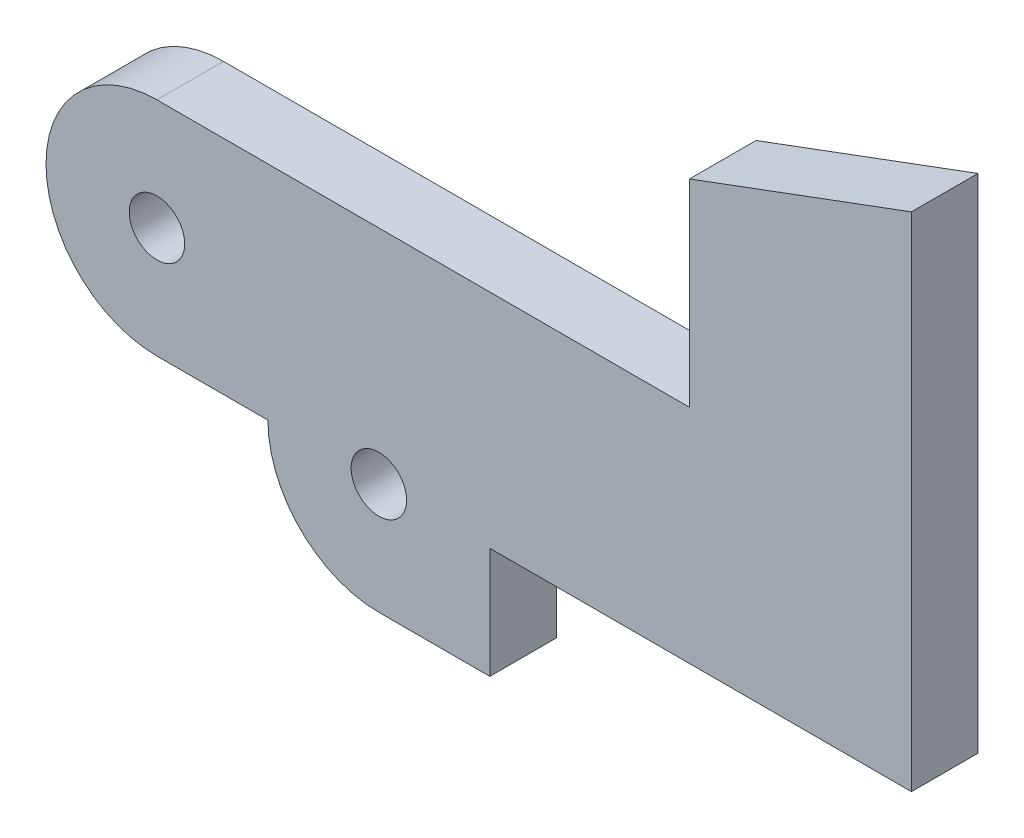
ISO-10303-21;
HEADER;
FILE_DESCRIPTION(('STEP AP214'),'2;1');
FILE_NAME('part.step','',(''),(''),'','','');
FILE_SCHEMA(('AUTOMOTIVE_DESIGN { 1 0 10303 214 1 1 1 1 }'));
ENDSEC;
DATA;
#1=APPLICATION_CONTEXT('core data for automotive mechanical design processes');
#2=APPLICATION_PROTOCOL_DEFINITION('international standard','automotive_design',2000,#1);
#3=PRODUCT_CONTEXT('',#1,'mechanical');
#4=PRODUCT('Part','Part','',(#3));
#5=PRODUCT_RELATED_PRODUCT_CATEGORY('part','',(#4));
#6=PRODUCT_DEFINITION_FORMATION('','',#4);
#7=PRODUCT_DEFINITION_CONTEXT('part definition',#1,'design');
#8=PRODUCT_DEFINITION('design','',#6,#7);
#9=PRODUCT_DEFINITION_SHAPE('','',#8);
#10=(LENGTH_UNIT() NAMED_UNIT(*) SI_UNIT(.MILLI.,.METRE.));
#11=(NAMED_UNIT(*) PLANE_ANGLE_UNIT() SI_UNIT($,.RADIAN.));
#12=(NAMED_UNIT(*) SI_UNIT($,.STERADIAN.) SOLID_ANGLE_UNIT());
#13=UNCERTAINTY_MEASURE_WITH_UNIT(LENGTH_MEASURE(1.E-05),#10,'distance_accuracy_value','');
#14=(GEOMETRIC_REPRESENTATION_CONTEXT(3) GLOBAL_UNCERTAINTY_ASSIGNED_CONTEXT((#13)) GLOBAL_UNIT_ASSIGNED_CONTEXT((#10,
#11,#12)) REPRESENTATION_CONTEXT('',''));
#15=CARTESIAN_POINT('',(0.,0.,0.));
#16=DIRECTION('',(0.,0.,1.));
#17=DIRECTION('',(1.,0.,0.));
#18=AXIS2_PLACEMENT_3D('',#15,#16,#17);
#19=CARTESIAN_POINT('',(-69.6861459032918,39.7463400227915,3.));
#20=DIRECTION('',(0.,1.,0.));
#21=DIRECTION('',(0.,0.,1.));
#22=AXIS2_PLACEMENT_3D('',#19,#20,#21);
#23=PLANE('',#22);
#24=DIRECTION('',(1.,0.,0.));
#25=VECTOR('',#24,1.);
#26=CARTESIAN_POINT('',(-69.6861459032918,39.7463400227915,0.));
#27=LINE('',#26,#25);
#28=CARTESIAN_POINT('',(-69.6861459032918,39.7463400227915,0.));
#29=VERTEX_POINT('',#28);
#30=CARTESIAN_POINT('',(-64.6861459032918,39.7463400227915,0.));
#31=VERTEX_POINT('',#30);
#32=EDGE_CURVE('E151',#29,#31,#27,.T.);
#33=ORIENTED_EDGE('',*,*,#32,.T.);
#34=DIRECTION('',(0.,0.,1.));
#35=VECTOR('',#34,1.);
#36=CARTESIAN_POINT('',(-64.6861459032918,39.7463400227915,0.));
#37=LINE('',#36,#35);
#38=CARTESIAN_POINT('',(-64.6861459032918,39.7463400227915,3.));
#39=VERTEX_POINT('',#38);
#40=EDGE_CURVE('E135',#31,#39,#37,.T.);
#41=ORIENTED_EDGE('',*,*,#40,.T.);
#42=DIRECTION('',(1.,0.,0.));
#43=VECTOR('',#42,1.);
#44=CARTESIAN_POINT('',(-69.6861459032918,39.7463400227915,3.));
#45=LINE('',#44,#43);
#46=CARTESIAN_POINT('',(-69.6861459032918,39.7463400227915,3.));
#47=VERTEX_POINT('',#46);
#48=EDGE_CURVE('E152',#47,#39,#45,.T.);
#49=ORIENTED_EDGE('',*,*,#48,.F.);
#50=DIRECTION('',(0.,0.,-1.));
#51=VECTOR('',#50,1.);
#52=CARTESIAN_POINT('',(-69.6861459032918,39.7463400227915,3.));
#53=LINE('',#52,#51);
#54=EDGE_CURVE('E155',#47,#29,#53,.T.);
#55=ORIENTED_EDGE('',*,*,#54,.T.);
#56=EDGE_LOOP('',(#33,#41,#49,#55));
#57=FACE_BOUND('',#56,.T.);
#58=ADVANCED_FACE('F33',(#57),#23,.F.);
#59=CARTESIAN_POINT('',(-69.6861459032918,44.7463400227915,3.));
#60=DIRECTION('',(0.,0.,1.));
#61=DIRECTION('',(1.,0.,0.));
#62=AXIS2_PLACEMENT_3D('',#59,#60,#61);
#63=PLANE('',#62);
#64=DIRECTION('',(0.,1.,0.));
#65=VECTOR('',#64,1.);
#66=CARTESIAN_POINT('',(-45.6861459032918,49.7463400227915,3.));
#67=LINE('',#66,#65);
#68=CARTESIAN_POINT('',(-45.6861459032918,49.7463400227915,3.));
#69=VERTEX_POINT('',#68);
#70=CARTESIAN_POINT('',(-45.6861459032918,58.6606257370772,3.));
#71=VERTEX_POINT('',#70);
#72=EDGE_CURVE('E222',#69,#71,#67,.T.);
#73=ORIENTED_EDGE('',*,*,#72,.F.);
#74=DIRECTION('',(1.,0.,0.));
#75=VECTOR('',#74,1.);
#76=CARTESIAN_POINT('',(-69.6861459032918,49.7463400227915,3.));
#77=LINE('',#76,#75);
#78=CARTESIAN_POINT('',(-69.6861459032918,49.7463400227915,3.));
#79=VERTEX_POINT('',#78);
#80=EDGE_CURVE('E218',#79,#69,#77,.T.);
#81=ORIENTED_EDGE('',*,*,#80,.F.);
#82=CARTESIAN_POINT('',(-69.6861459032918,44.7463400227915,3.));
#83=DIRECTION('',(0.,0.,1.));
#84=DIRECTION('',(1.,0.,0.));
#85=AXIS2_PLACEMENT_3D('',#82,#83,#84);
#86=CIRCLE('',#85,5.);
#87=EDGE_CURVE('E148',#79,#47,#86,.T.);
#88=ORIENTED_EDGE('',*,*,#87,.T.);
#89=ORIENTED_EDGE('',*,*,#48,.T.);
#90=CARTESIAN_POINT('',(-59.6861459032918,39.7463400227915,3.));
#91=DIRECTION('',(0.,0.,1.));
#92=DIRECTION('',(1.,0.,0.));
#93=AXIS2_PLACEMENT_3D('',#90,#91,#92);
#94=CIRCLE('',#93,5.);
#95=CARTESIAN_POINT('',(-59.6861459032918,34.7463400227915,3.));
#96=VERTEX_POINT('',#95);
#97=EDGE_CURVE('E136',#39,#96,#94,.T.);
#98=ORIENTED_EDGE('',*,*,#97,.T.);
#99=DIRECTION('',(1.,0.,0.));
#100=VECTOR('',#99,1.);
#101=CARTESIAN_POINT('',(-59.6861459032918,34.7463400227915,3.));
#102=LINE('',#101,#100);
#103=CARTESIAN_POINT('',(-54.6861459032918,34.7463400227915,3.));
#104=VERTEX_POINT('',#103);
#105=EDGE_CURVE('E116',#96,#104,#102,.T.);
#106=ORIENTED_EDGE('',*,*,#105,.T.);
#107=DIRECTION('',(0.,1.,0.));
#108=VECTOR('',#107,1.);
#109=CARTESIAN_POINT('',(-54.6861459032918,34.7463400227915,3.));
#110=LINE('',#109,#108);
#111=CARTESIAN_POINT('',(-54.6861459032918,39.7463400227915,3.));
#112=VERTEX_POINT('',#111);
#113=EDGE_CURVE('E56',#104,#112,#110,.T.);
#114=ORIENTED_EDGE('',*,*,#113,.T.);
#115=CARTESIAN_POINT('',(-35.6861459032918,39.7463400227915,3.));
#116=VERTEX_POINT('',#115);
#117=EDGE_CURVE('E150',#112,#116,#45,.T.);
#118=ORIENTED_EDGE('',*,*,#117,.T.);
#119=DIRECTION('',(0.,-1.,0.));
#120=VECTOR('',#119,1.);
#121=CARTESIAN_POINT('',(-35.6861459032918,39.7463400227915,3.));
#122=LINE('',#121,#120);
#123=CARTESIAN_POINT('',(-35.6861459032918,62.3749114513629,3.));
#124=VERTEX_POINT('',#123);
#125=EDGE_CURVE('E165',#124,#116,#122,.T.);
#126=ORIENTED_EDGE('',*,*,#125,.F.);
#127=DIRECTION('',(-0.937425272009765,-0.348186529603627,0.));
#128=VECTOR('',#127,1.);
#129=CARTESIAN_POINT('',(-34.6861459032918,62.7463400227915,3.));
#130=LINE('',#129,#128);
#131=EDGE_CURVE('E175',#124,#71,#130,.T.);
#132=ORIENTED_EDGE('',*,*,#131,.T.);
#133=EDGE_LOOP('',(#73,#81,#88,#89,#98,#106,#114,#118,#126,#132));
#134=FACE_BOUND('',#133,.T.);
#135=CARTESIAN_POINT('',(-59.6861459032918,39.7463400227915,3.));
#136=DIRECTION('',(0.,0.,1.));
#137=DIRECTION('',(1.,0.,0.));
#138=AXIS2_PLACEMENT_3D('',#135,#136,#137);
#139=CIRCLE('',#138,1.25);
#140=CARTESIAN_POINT('',(-58.4361459032918,39.7463400227915,3.));
#141=VERTEX_POINT('',#140);
#142=EDGE_CURVE('E143',#141,#141,#139,.T.);
#143=ORIENTED_EDGE('',*,*,#142,.F.);
#144=EDGE_LOOP('',(#143));
#145=FACE_BOUND('',#144,.T.);
#146=CARTESIAN_POINT('',(-69.6861459032918,44.7463400227915,3.));
#147=DIRECTION('',(0.,0.,1.));
#148=DIRECTION('',(1.,0.,0.));
#149=AXIS2_PLACEMENT_3D('',#146,#147,#148);
#150=CIRCLE('',#149,1.25);
#151=CARTESIAN_POINT('',(-68.4361459032918,44.7463400227915,3.));
#152=VERTEX_POINT('',#151);
#153=EDGE_CURVE('E198',#152,#152,#150,.T.);
#154=ORIENTED_EDGE('',*,*,#153,.F.);
#155=EDGE_LOOP('',(#154));
#156=FACE_BOUND('',#155,.T.);
#157=ADVANCED_FACE('F173',(#134,#145,#156),#63,.T.);
#158=CARTESIAN_POINT('',(-69.6861459032918,44.7463400227915,0.));
#159=DIRECTION('',(0.,0.,1.));
#160=DIRECTION('',(1.,0.,0.));
#161=AXIS2_PLACEMENT_3D('',#158,#159,#160);
#162=PLANE('',#161);
#163=CARTESIAN_POINT('',(-59.6861459032918,39.7463400227915,0.));
#164=DIRECTION('',(0.,0.,1.));
#165=DIRECTION('',(1.,0.,0.));
#166=AXIS2_PLACEMENT_3D('',#163,#164,#165);
#167=CIRCLE('',#166,1.25);
#168=CARTESIAN_POINT('',(-58.4361459032918,39.7463400227915,0.));
#169=VERTEX_POINT('',#168);
#170=EDGE_CURVE('E140',#169,#169,#167,.T.);
#171=ORIENTED_EDGE('',*,*,#170,.T.);
#172=EDGE_LOOP('',(#171));
#173=FACE_BOUND('',#172,.T.);
#174=DIRECTION('',(1.,0.,0.));
#175=VECTOR('',#174,1.);
#176=CARTESIAN_POINT('',(-69.6861459032918,49.7463400227915,0.));
#177=LINE('',#176,#175);
#178=CARTESIAN_POINT('',(-69.6861459032918,49.7463400227915,0.));
#179=VERTEX_POINT('',#178);
#180=CARTESIAN_POINT('',(-45.6861459032918,49.7463400227915,0.));
#181=VERTEX_POINT('',#180);
#182=EDGE_CURVE('E205',#179,#181,#177,.T.);
#183=ORIENTED_EDGE('',*,*,#182,.T.);
#184=DIRECTION('',(0.,1.,0.));
#185=VECTOR('',#184,1.);
#186=CARTESIAN_POINT('',(-45.6861459032918,44.7463400227915,0.));
#187=LINE('',#186,#185);
#188=CARTESIAN_POINT('',(-45.6861459032918,58.6606257370772,0.));
#189=VERTEX_POINT('',#188);
#190=EDGE_CURVE('E200',#181,#189,#187,.T.);
#191=ORIENTED_EDGE('',*,*,#190,.T.);
#192=DIRECTION('',(-0.937425272009765,-0.348186529603627,0.));
#193=VECTOR('',#192,1.);
#194=CARTESIAN_POINT('',(-34.6861459032918,62.7463400227915,0.));
#195=LINE('',#194,#193);
#196=CARTESIAN_POINT('',(-35.6861459032918,62.3749114513629,0.));
#197=VERTEX_POINT('',#196);
#198=EDGE_CURVE('E181',#197,#189,#195,.T.);
#199=ORIENTED_EDGE('',*,*,#198,.F.);
#200=DIRECTION('',(0.,-1.,0.));
#201=VECTOR('',#200,1.);
#202=CARTESIAN_POINT('',(-35.6861459032918,39.7463400227915,0.));
#203=LINE('',#202,#201);
#204=CARTESIAN_POINT('',(-35.6861459032918,39.7463400227915,0.));
#205=VERTEX_POINT('',#204);
#206=EDGE_CURVE('E48',#197,#205,#203,.T.);
#207=ORIENTED_EDGE('',*,*,#206,.T.);
#208=CARTESIAN_POINT('',(-54.6861459032918,39.7463400227915,0.));
#209=VERTEX_POINT('',#208);
#210=EDGE_CURVE('E157',#209,#205,#27,.T.);
#211=ORIENTED_EDGE('',*,*,#210,.F.);
#212=DIRECTION('',(0.,1.,0.));
#213=VECTOR('',#212,1.);
#214=CARTESIAN_POINT('',(-54.6861459032918,34.7463400227915,0.));
#215=LINE('',#214,#213);
#216=CARTESIAN_POINT('',(-54.6861459032918,34.7463400227915,0.));
#217=VERTEX_POINT('',#216);
#218=EDGE_CURVE('E121',#217,#209,#215,.T.);
#219=ORIENTED_EDGE('',*,*,#218,.F.);
#220=DIRECTION('',(1.,0.,0.));
#221=VECTOR('',#220,1.);
#222=CARTESIAN_POINT('',(-59.6861459032918,34.7463400227915,0.));
#223=LINE('',#222,#221);
#224=CARTESIAN_POINT('',(-59.6861459032918,34.7463400227915,0.));
#225=VERTEX_POINT('',#224);
#226=EDGE_CURVE('E114',#225,#217,#223,.T.);
#227=ORIENTED_EDGE('',*,*,#226,.F.);
#228=CARTESIAN_POINT('',(-59.6861459032918,39.7463400227915,0.));
#229=DIRECTION('',(0.,0.,1.));
#230=DIRECTION('',(1.,0.,0.));
#231=AXIS2_PLACEMENT_3D('',#228,#229,#230);
#232=CIRCLE('',#231,5.);
#233=EDGE_CURVE('E129',#31,#225,#232,.T.);
#234=ORIENTED_EDGE('',*,*,#233,.F.);
#235=ORIENTED_EDGE('',*,*,#32,.F.);
#236=CARTESIAN_POINT('',(-69.6861459032918,44.7463400227915,0.));
#237=DIRECTION('',(0.,0.,1.));
#238=DIRECTION('',(1.,0.,0.));
#239=AXIS2_PLACEMENT_3D('',#236,#237,#238);
#240=CIRCLE('',#239,5.);
#241=EDGE_CURVE('E146',#179,#29,#240,.T.);
#242=ORIENTED_EDGE('',*,*,#241,.F.);
#243=EDGE_LOOP('',(#183,#191,#199,#207,#211,#219,#227,#234,#235,#242));
#244=FACE_BOUND('',#243,.T.);
#245=CARTESIAN_POINT('',(-69.6861459032918,44.7463400227915,0.));
#246=DIRECTION('',(0.,0.,1.));
#247=DIRECTION('',(1.,0.,0.));
#248=AXIS2_PLACEMENT_3D('',#245,#246,#247);
#249=CIRCLE('',#248,1.25);
#250=CARTESIAN_POINT('',(-68.4361459032918,44.7463400227915,0.));
#251=VERTEX_POINT('',#250);
#252=EDGE_CURVE('E177',#251,#251,#249,.T.);
#253=ORIENTED_EDGE('',*,*,#252,.T.);
#254=EDGE_LOOP('',(#253));
#255=FACE_BOUND('',#254,.T.);
#256=ADVANCED_FACE('F126',(#173,#244,#255),#162,.F.);
#257=CARTESIAN_POINT('',(-69.6861459032918,44.7463400227915,3.));
#258=DIRECTION('',(0.,0.,-1.));
#259=DIRECTION('',(-1.,0.,0.));
#260=AXIS2_PLACEMENT_3D('',#257,#258,#259);
#261=CYLINDRICAL_SURFACE('',#260,5.);
#262=ORIENTED_EDGE('',*,*,#241,.T.);
#263=ORIENTED_EDGE('',*,*,#54,.F.);
#264=ORIENTED_EDGE('',*,*,#87,.F.);
#265=DIRECTION('',(0.,0.,-1.));
#266=VECTOR('',#265,1.);
#267=CARTESIAN_POINT('',(-69.6861459032918,49.7463400227915,3.));
#268=LINE('',#267,#266);
#269=EDGE_CURVE('E161',#79,#179,#268,.T.);
#270=ORIENTED_EDGE('',*,*,#269,.T.);
#271=EDGE_LOOP('',(#262,#263,#264,#270));
#272=FACE_BOUND('',#271,.T.);
#273=ADVANCED_FACE('F35',(#272),#261,.T.);
#274=ORIENTED_EDGE('',*,*,#210,.T.);
#275=DIRECTION('',(0.,0.,1.));
#276=VECTOR('',#275,1.);
#277=CARTESIAN_POINT('',(-35.6861459032918,39.7463400227915,0.));
#278=LINE('',#277,#276);
#279=EDGE_CURVE('E182',#205,#116,#278,.T.);
#280=ORIENTED_EDGE('',*,*,#279,.T.);
#281=ORIENTED_EDGE('',*,*,#117,.F.);
#282=DIRECTION('',(0.,0.,1.));
#283=VECTOR('',#282,1.);
#284=CARTESIAN_POINT('',(-54.6861459032918,39.7463400227915,0.));
#285=LINE('',#284,#283);
#286=EDGE_CURVE('E138',#209,#112,#285,.T.);
#287=ORIENTED_EDGE('',*,*,#286,.F.);
#288=EDGE_LOOP('',(#274,#280,#281,#287));
#289=FACE_BOUND('',#288,.T.);
#290=ADVANCED_FACE('F211',(#289),#23,.F.);
#291=CARTESIAN_POINT('',(-59.6861459032918,39.7463400227915,0.));
#292=DIRECTION('',(0.,0.,1.));
#293=DIRECTION('',(1.,0.,0.));
#294=AXIS2_PLACEMENT_3D('',#291,#292,#293);
#295=CYLINDRICAL_SURFACE('',#294,5.);
#296=DIRECTION('',(0.,0.,1.));
#297=VECTOR('',#296,1.);
#298=CARTESIAN_POINT('',(-59.6861459032918,34.7463400227915,0.));
#299=LINE('',#298,#297);
#300=EDGE_CURVE('E111',#225,#96,#299,.T.);
#301=ORIENTED_EDGE('',*,*,#300,.T.);
#302=ORIENTED_EDGE('',*,*,#97,.F.);
#303=ORIENTED_EDGE('',*,*,#40,.F.);
#304=ORIENTED_EDGE('',*,*,#233,.T.);
#305=EDGE_LOOP('',(#301,#302,#303,#304));
#306=FACE_BOUND('',#305,.T.);
#307=ADVANCED_FACE('F133',(#306),#295,.T.);
#308=CARTESIAN_POINT('',(-59.6861459032918,39.7463400227915,0.));
#309=DIRECTION('',(0.,0.,1.));
#310=DIRECTION('',(1.,0.,0.));
#311=AXIS2_PLACEMENT_3D('',#308,#309,#310);
#312=CYLINDRICAL_SURFACE('',#311,1.25);
#313=ORIENTED_EDGE('',*,*,#170,.F.);
#314=EDGE_LOOP('',(#313));
#315=FACE_BOUND('',#314,.T.);
#316=ORIENTED_EDGE('',*,*,#142,.T.);
#317=EDGE_LOOP('',(#316));
#318=FACE_BOUND('',#317,.T.);
#319=ADVANCED_FACE('F192',(#315,#318),#312,.F.);
#320=CARTESIAN_POINT('',(-34.6861459032918,62.7463400227915,0.));
#321=DIRECTION('',(-0.348186529603627,0.937425272009765,0.));
#322=DIRECTION('',(-0.937425272009766,-0.348186529603627,0.));
#323=AXIS2_PLACEMENT_3D('',#320,#321,#322);
#324=PLANE('',#323);
#325=DIRECTION('',(0.,0.,-1.));
#326=VECTOR('',#325,1.);
#327=CARTESIAN_POINT('',(-45.6861459032918,58.6606257370772,0.));
#328=LINE('',#327,#326);
#329=EDGE_CURVE('E11',#71,#189,#328,.T.);
#330=ORIENTED_EDGE('',*,*,#329,.F.);
#331=ORIENTED_EDGE('',*,*,#131,.F.);
#332=DIRECTION('',(0.,0.,1.));
#333=VECTOR('',#332,1.);
#334=CARTESIAN_POINT('',(-35.6861459032918,62.3749114513629,0.));
#335=LINE('',#334,#333);
#336=EDGE_CURVE('E41',#197,#124,#335,.T.);
#337=ORIENTED_EDGE('',*,*,#336,.F.);
#338=ORIENTED_EDGE('',*,*,#198,.T.);
#339=EDGE_LOOP('',(#330,#331,#337,#338));
#340=FACE_BOUND('',#339,.T.);
#341=ADVANCED_FACE('F180',(#340),#324,.T.);
#342=CARTESIAN_POINT('',(-35.6861459032918,39.7463400227915,0.));
#343=DIRECTION('',(-1.,0.,0.));
#344=DIRECTION('',(0.,0.,1.));
#345=AXIS2_PLACEMENT_3D('',#342,#343,#344);
#346=PLANE('',#345);
#347=ORIENTED_EDGE('',*,*,#336,.T.);
#348=ORIENTED_EDGE('',*,*,#125,.T.);
#349=ORIENTED_EDGE('',*,*,#279,.F.);
#350=ORIENTED_EDGE('',*,*,#206,.F.);
#351=EDGE_LOOP('',(#347,#348,#349,#350));
#352=FACE_BOUND('',#351,.T.);
#353=ADVANCED_FACE('F164',(#352),#346,.F.);
#354=CARTESIAN_POINT('',(-69.6861459032918,44.7463400227915,0.));
#355=DIRECTION('',(0.,0.,1.));
#356=DIRECTION('',(1.,0.,0.));
#357=AXIS2_PLACEMENT_3D('',#354,#355,#356);
#358=CYLINDRICAL_SURFACE('',#357,1.25);
#359=ORIENTED_EDGE('',*,*,#252,.F.);
#360=EDGE_LOOP('',(#359));
#361=FACE_BOUND('',#360,.T.);
#362=ORIENTED_EDGE('',*,*,#153,.T.);
#363=EDGE_LOOP('',(#362));
#364=FACE_BOUND('',#363,.T.);
#365=ADVANCED_FACE('F238',(#361,#364),#358,.F.);
#366=CARTESIAN_POINT('',(-45.6861459032918,49.7463400227915,-7.));
#367=DIRECTION('',(1.,0.,0.));
#368=DIRECTION('',(0.,0.,-1.));
#369=AXIS2_PLACEMENT_3D('',#366,#367,#368);
#370=PLANE('',#369);
#371=DIRECTION('',(0.,0.,1.));
#372=VECTOR('',#371,1.);
#373=CARTESIAN_POINT('',(-45.6861459032918,49.7463400227915,-7.));
#374=LINE('',#373,#372);
#375=EDGE_CURVE('E224',#181,#69,#374,.T.);
#376=ORIENTED_EDGE('',*,*,#375,.T.);
#377=ORIENTED_EDGE('',*,*,#72,.T.);
#378=ORIENTED_EDGE('',*,*,#329,.T.);
#379=ORIENTED_EDGE('',*,*,#190,.F.);
#380=EDGE_LOOP('',(#376,#377,#378,#379));
#381=FACE_BOUND('',#380,.T.);
#382=ADVANCED_FACE('F236',(#381),#370,.F.);
#383=CARTESIAN_POINT('',(-69.6861459032918,49.7463400227915,-7.));
#384=DIRECTION('',(0.,-1.,0.));
#385=DIRECTION('',(0.,0.,-1.));
#386=AXIS2_PLACEMENT_3D('',#383,#384,#385);
#387=PLANE('',#386);
#388=ORIENTED_EDGE('',*,*,#269,.F.);
#389=ORIENTED_EDGE('',*,*,#80,.T.);
#390=ORIENTED_EDGE('',*,*,#375,.F.);
#391=ORIENTED_EDGE('',*,*,#182,.F.);
#392=EDGE_LOOP('',(#388,#389,#390,#391));
#393=FACE_BOUND('',#392,.T.);
#394=ADVANCED_FACE('F229',(#393),#387,.F.);
#395=CARTESIAN_POINT('',(-54.6861459032918,34.7463400227915,0.));
#396=DIRECTION('',(1.,0.,0.));
#397=DIRECTION('',(0.,0.,-1.));
#398=AXIS2_PLACEMENT_3D('',#395,#396,#397);
#399=PLANE('',#398);
#400=ORIENTED_EDGE('',*,*,#113,.F.);
#401=DIRECTION('',(0.,0.,1.));
#402=VECTOR('',#401,1.);
#403=CARTESIAN_POINT('',(-54.6861459032918,34.7463400227915,0.));
#404=LINE('',#403,#402);
#405=EDGE_CURVE('E120',#217,#104,#404,.T.);
#406=ORIENTED_EDGE('',*,*,#405,.F.);
#407=ORIENTED_EDGE('',*,*,#218,.T.);
#408=ORIENTED_EDGE('',*,*,#286,.T.);
#409=EDGE_LOOP('',(#400,#406,#407,#408));
#410=FACE_BOUND('',#409,.T.);
#411=ADVANCED_FACE('F213',(#410),#399,.T.);
#412=CARTESIAN_POINT('',(-59.6861459032918,34.7463400227915,0.));
#413=DIRECTION('',(0.,-1.,0.));
#414=DIRECTION('',(0.,0.,-1.));
#415=AXIS2_PLACEMENT_3D('',#412,#413,#414);
#416=PLANE('',#415);
#417=ORIENTED_EDGE('',*,*,#105,.F.);
#418=ORIENTED_EDGE('',*,*,#300,.F.);
#419=ORIENTED_EDGE('',*,*,#226,.T.);
#420=ORIENTED_EDGE('',*,*,#405,.T.);
#421=EDGE_LOOP('',(#417,#418,#419,#420));
#422=FACE_BOUND('',#421,.T.);
#423=ADVANCED_FACE('F113',(#422),#416,.T.);
#424=CLOSED_SHELL('',(#58,#157,#256,#273,#290,#307,#319,#341,#353,#365,#382,#394,#411,#423));
#425=MANIFOLD_SOLID_BREP('B2',#424);
#426=ADVANCED_BREP_SHAPE_REPRESENTATION('',(#18,#425),#14);
#427=SHAPE_DEFINITION_REPRESENTATION(#9,#426);
ENDSEC;
END-ISO-10303-21;
